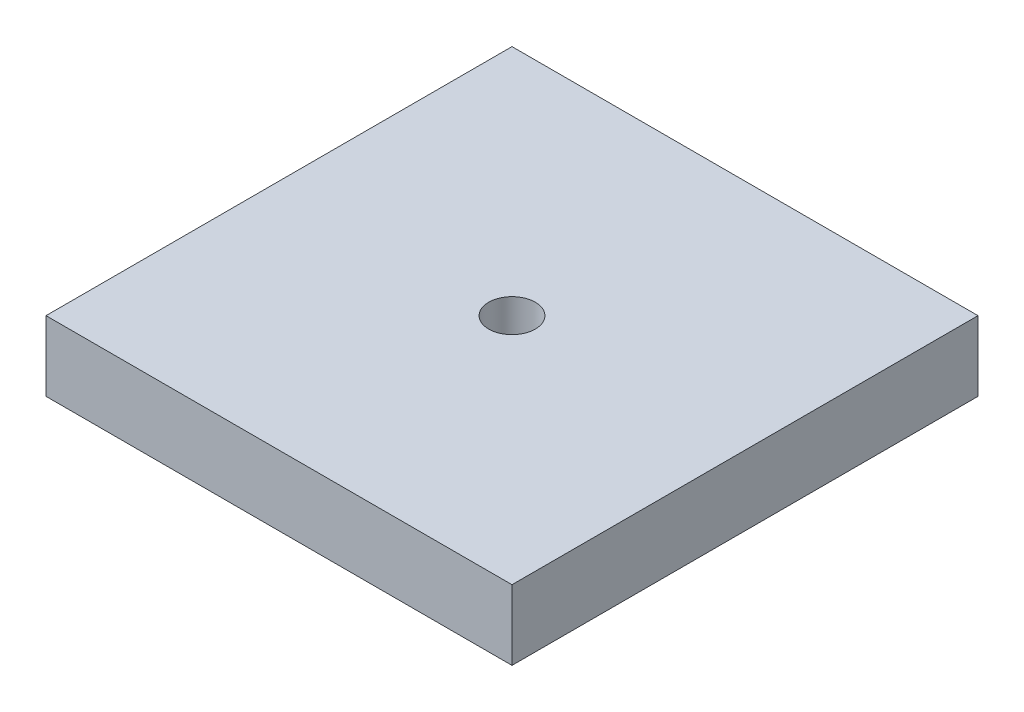
ISO-10303-21;
HEADER;
FILE_DESCRIPTION(('STEP AP214'),'2;1');
FILE_NAME('part.step','',(''),(''),'','','');
FILE_SCHEMA(('AUTOMOTIVE_DESIGN { 1 0 10303 214 1 1 1 1 }'));
ENDSEC;
DATA;
#1=APPLICATION_CONTEXT('core data for automotive mechanical design processes');
#2=APPLICATION_PROTOCOL_DEFINITION('international standard','automotive_design',2000,#1);
#3=PRODUCT_CONTEXT('',#1,'mechanical');
#4=PRODUCT('Part','Part','',(#3));
#5=PRODUCT_RELATED_PRODUCT_CATEGORY('part','',(#4));
#6=PRODUCT_DEFINITION_FORMATION('','',#4);
#7=PRODUCT_DEFINITION_CONTEXT('part definition',#1,'design');
#8=PRODUCT_DEFINITION('design','',#6,#7);
#9=PRODUCT_DEFINITION_SHAPE('','',#8);
#10=(LENGTH_UNIT() NAMED_UNIT(*) SI_UNIT(.MILLI.,.METRE.));
#11=(NAMED_UNIT(*) PLANE_ANGLE_UNIT() SI_UNIT($,.RADIAN.));
#12=(NAMED_UNIT(*) SI_UNIT($,.STERADIAN.) SOLID_ANGLE_UNIT());
#13=UNCERTAINTY_MEASURE_WITH_UNIT(LENGTH_MEASURE(1.E-05),#10,'distance_accuracy_value','');
#14=(GEOMETRIC_REPRESENTATION_CONTEXT(3) GLOBAL_UNCERTAINTY_ASSIGNED_CONTEXT((#13)) GLOBAL_UNIT_ASSIGNED_CONTEXT((#10,
#11,#12)) REPRESENTATION_CONTEXT('',''));
#15=CARTESIAN_POINT('',(0.,0.,0.));
#16=DIRECTION('',(0.,0.,1.));
#17=DIRECTION('',(1.,0.,0.));
#18=AXIS2_PLACEMENT_3D('',#15,#16,#17);
#19=CARTESIAN_POINT('',(0.,38.1,0.));
#20=DIRECTION('',(0.,1.,0.));
#21=DIRECTION('',(0.,0.,1.));
#22=AXIS2_PLACEMENT_3D('',#19,#20,#21);
#23=PLANE('',#22);
#24=DIRECTION('',(0.,0.,-1.));
#25=VECTOR('',#24,1.);
#26=CARTESIAN_POINT('',(127.,38.1,-127.));
#27=LINE('',#26,#25);
#28=CARTESIAN_POINT('',(127.,38.1,127.));
#29=VERTEX_POINT('',#28);
#30=CARTESIAN_POINT('',(127.,38.1,-127.));
#31=VERTEX_POINT('',#30);
#32=EDGE_CURVE('E85',#29,#31,#27,.T.);
#33=ORIENTED_EDGE('',*,*,#32,.T.);
#34=DIRECTION('',(-1.,0.,0.));
#35=VECTOR('',#34,1.);
#36=CARTESIAN_POINT('',(-127.,38.1,-127.));
#37=LINE('',#36,#35);
#38=CARTESIAN_POINT('',(-127.,38.1,-127.));
#39=VERTEX_POINT('',#38);
#40=EDGE_CURVE('E80',#31,#39,#37,.T.);
#41=ORIENTED_EDGE('',*,*,#40,.T.);
#42=DIRECTION('',(0.,0.,1.));
#43=VECTOR('',#42,1.);
#44=CARTESIAN_POINT('',(-127.,38.1,-127.));
#45=LINE('',#44,#43);
#46=CARTESIAN_POINT('',(-127.,38.1,127.));
#47=VERTEX_POINT('',#46);
#48=EDGE_CURVE('E83',#39,#47,#45,.T.);
#49=ORIENTED_EDGE('',*,*,#48,.T.);
#50=DIRECTION('',(1.,0.,0.));
#51=VECTOR('',#50,1.);
#52=CARTESIAN_POINT('',(-127.,38.1,127.));
#53=LINE('',#52,#51);
#54=EDGE_CURVE('E50',#47,#29,#53,.T.);
#55=ORIENTED_EDGE('',*,*,#54,.T.);
#56=EDGE_LOOP('',(#33,#41,#49,#55));
#57=FACE_BOUND('',#56,.T.);
#58=CARTESIAN_POINT('',(0.,38.1,0.));
#59=DIRECTION('',(0.,1.,0.));
#60=DIRECTION('',(0.,0.,1.));
#61=AXIS2_PLACEMENT_3D('',#58,#59,#60);
#62=CIRCLE('',#61,12.7);
#63=CARTESIAN_POINT('',(0.,38.1,-12.7));
#64=VERTEX_POINT('',#63);
#65=EDGE_CURVE('E100',#64,#64,#62,.T.);
#66=ORIENTED_EDGE('',*,*,#65,.F.);
#67=EDGE_LOOP('',(#66));
#68=FACE_BOUND('',#67,.T.);
#69=ADVANCED_FACE('F33',(#57,#68),#23,.T.);
#70=CARTESIAN_POINT('',(0.,0.,0.));
#71=DIRECTION('',(0.,1.,0.));
#72=DIRECTION('',(0.,0.,1.));
#73=AXIS2_PLACEMENT_3D('',#70,#71,#72);
#74=PLANE('',#73);
#75=DIRECTION('',(0.,0.,-1.));
#76=VECTOR('',#75,1.);
#77=CARTESIAN_POINT('',(127.,0.,-127.));
#78=LINE('',#77,#76);
#79=CARTESIAN_POINT('',(127.,0.,127.));
#80=VERTEX_POINT('',#79);
#81=CARTESIAN_POINT('',(127.,0.,-127.));
#82=VERTEX_POINT('',#81);
#83=EDGE_CURVE('E97',#80,#82,#78,.T.);
#84=ORIENTED_EDGE('',*,*,#83,.F.);
#85=DIRECTION('',(1.,0.,0.));
#86=VECTOR('',#85,1.);
#87=CARTESIAN_POINT('',(-127.,0.,127.));
#88=LINE('',#87,#86);
#89=CARTESIAN_POINT('',(-127.,0.,127.));
#90=VERTEX_POINT('',#89);
#91=EDGE_CURVE('E73',#90,#80,#88,.T.);
#92=ORIENTED_EDGE('',*,*,#91,.F.);
#93=DIRECTION('',(0.,0.,1.));
#94=VECTOR('',#93,1.);
#95=CARTESIAN_POINT('',(-127.,0.,-127.));
#96=LINE('',#95,#94);
#97=CARTESIAN_POINT('',(-127.,0.,-127.));
#98=VERTEX_POINT('',#97);
#99=EDGE_CURVE('E67',#98,#90,#96,.T.);
#100=ORIENTED_EDGE('',*,*,#99,.F.);
#101=DIRECTION('',(-1.,0.,0.));
#102=VECTOR('',#101,1.);
#103=CARTESIAN_POINT('',(-127.,0.,-127.));
#104=LINE('',#103,#102);
#105=EDGE_CURVE('E89',#82,#98,#104,.T.);
#106=ORIENTED_EDGE('',*,*,#105,.F.);
#107=EDGE_LOOP('',(#84,#92,#100,#106));
#108=FACE_BOUND('',#107,.T.);
#109=CARTESIAN_POINT('',(0.,0.,0.));
#110=DIRECTION('',(0.,1.,0.));
#111=DIRECTION('',(0.,0.,1.));
#112=AXIS2_PLACEMENT_3D('',#109,#110,#111);
#113=CIRCLE('',#112,12.7);
#114=CARTESIAN_POINT('',(0.,0.,-12.7));
#115=VERTEX_POINT('',#114);
#116=EDGE_CURVE('E112',#115,#115,#113,.T.);
#117=ORIENTED_EDGE('',*,*,#116,.T.);
#118=EDGE_LOOP('',(#117));
#119=FACE_BOUND('',#118,.T.);
#120=ADVANCED_FACE('F108',(#108,#119),#74,.F.);
#121=CARTESIAN_POINT('',(127.,38.1,-127.));
#122=DIRECTION('',(-1.,0.,0.));
#123=DIRECTION('',(0.,0.,1.));
#124=AXIS2_PLACEMENT_3D('',#121,#122,#123);
#125=PLANE('',#124);
#126=ORIENTED_EDGE('',*,*,#83,.T.);
#127=DIRECTION('',(0.,-1.,0.));
#128=VECTOR('',#127,1.);
#129=CARTESIAN_POINT('',(127.,38.1,-127.));
#130=LINE('',#129,#128);
#131=EDGE_CURVE('E11',#31,#82,#130,.T.);
#132=ORIENTED_EDGE('',*,*,#131,.F.);
#133=ORIENTED_EDGE('',*,*,#32,.F.);
#134=DIRECTION('',(0.,-1.,0.));
#135=VECTOR('',#134,1.);
#136=CARTESIAN_POINT('',(127.,38.1,127.));
#137=LINE('',#136,#135);
#138=EDGE_CURVE('E93',#29,#80,#137,.T.);
#139=ORIENTED_EDGE('',*,*,#138,.T.);
#140=EDGE_LOOP('',(#126,#132,#133,#139));
#141=FACE_BOUND('',#140,.T.);
#142=ADVANCED_FACE('F35',(#141),#125,.F.);
#143=CARTESIAN_POINT('',(-127.,38.1,-127.));
#144=DIRECTION('',(0.,0.,1.));
#145=DIRECTION('',(1.,0.,0.));
#146=AXIS2_PLACEMENT_3D('',#143,#144,#145);
#147=PLANE('',#146);
#148=ORIENTED_EDGE('',*,*,#105,.T.);
#149=DIRECTION('',(0.,-1.,0.));
#150=VECTOR('',#149,1.);
#151=CARTESIAN_POINT('',(-127.,38.1,-127.));
#152=LINE('',#151,#150);
#153=EDGE_CURVE('E42',#39,#98,#152,.T.);
#154=ORIENTED_EDGE('',*,*,#153,.F.);
#155=ORIENTED_EDGE('',*,*,#40,.F.);
#156=ORIENTED_EDGE('',*,*,#131,.T.);
#157=EDGE_LOOP('',(#148,#154,#155,#156));
#158=FACE_BOUND('',#157,.T.);
#159=ADVANCED_FACE('F88',(#158),#147,.F.);
#160=CARTESIAN_POINT('',(-127.,38.1,-127.));
#161=DIRECTION('',(1.,0.,0.));
#162=DIRECTION('',(0.,0.,-1.));
#163=AXIS2_PLACEMENT_3D('',#160,#161,#162);
#164=PLANE('',#163);
#165=ORIENTED_EDGE('',*,*,#99,.T.);
#166=DIRECTION('',(0.,-1.,0.));
#167=VECTOR('',#166,1.);
#168=CARTESIAN_POINT('',(-127.,38.1,127.));
#169=LINE('',#168,#167);
#170=EDGE_CURVE('E90',#47,#90,#169,.T.);
#171=ORIENTED_EDGE('',*,*,#170,.F.);
#172=ORIENTED_EDGE('',*,*,#48,.F.);
#173=ORIENTED_EDGE('',*,*,#153,.T.);
#174=EDGE_LOOP('',(#165,#171,#172,#173));
#175=FACE_BOUND('',#174,.T.);
#176=ADVANCED_FACE('F91',(#175),#164,.F.);
#177=CARTESIAN_POINT('',(-127.,38.1,127.));
#178=DIRECTION('',(0.,0.,-1.));
#179=DIRECTION('',(-1.,0.,0.));
#180=AXIS2_PLACEMENT_3D('',#177,#178,#179);
#181=PLANE('',#180);
#182=ORIENTED_EDGE('',*,*,#91,.T.);
#183=ORIENTED_EDGE('',*,*,#138,.F.);
#184=ORIENTED_EDGE('',*,*,#54,.F.);
#185=ORIENTED_EDGE('',*,*,#170,.T.);
#186=EDGE_LOOP('',(#182,#183,#184,#185));
#187=FACE_BOUND('',#186,.T.);
#188=ADVANCED_FACE('F105',(#187),#181,.F.);
#189=CARTESIAN_POINT('',(0.,38.1,0.));
#190=DIRECTION('',(0.,-1.,0.));
#191=DIRECTION('',(0.,0.,-1.));
#192=AXIS2_PLACEMENT_3D('',#189,#190,#191);
#193=CYLINDRICAL_SURFACE('',#192,12.7);
#194=CARTESIAN_POINT('',(0.,38.1,-12.7));
#195=CARTESIAN_POINT('',(0.,37.703125,-12.7));
#196=CARTESIAN_POINT('',(0.,37.30625,-12.7));
#197=CARTESIAN_POINT('',(0.,36.5125,-12.7));
#198=CARTESIAN_POINT('',(0.,36.115625,-12.7));
#199=CARTESIAN_POINT('',(0.,35.321875,-12.7));
#200=CARTESIAN_POINT('',(0.,34.925,-12.7));
#201=CARTESIAN_POINT('',(0.,34.13125,-12.7));
#202=CARTESIAN_POINT('',(0.,33.734375,-12.7));
#203=CARTESIAN_POINT('',(0.,32.940625,-12.7));
#204=CARTESIAN_POINT('',(0.,32.54375,-12.7));
#205=CARTESIAN_POINT('',(0.,31.75,-12.7));
#206=CARTESIAN_POINT('',(0.,31.353125,-12.7));
#207=CARTESIAN_POINT('',(0.,30.559375,-12.7));
#208=CARTESIAN_POINT('',(0.,30.1625,-12.7));
#209=CARTESIAN_POINT('',(0.,29.36875,-12.7));
#210=CARTESIAN_POINT('',(0.,28.971875,-12.7));
#211=CARTESIAN_POINT('',(0.,28.178125,-12.7));
#212=CARTESIAN_POINT('',(0.,27.78125,-12.7));
#213=CARTESIAN_POINT('',(0.,26.9875,-12.7));
#214=CARTESIAN_POINT('',(0.,26.590625,-12.7));
#215=CARTESIAN_POINT('',(0.,25.796875,-12.7));
#216=CARTESIAN_POINT('',(0.,25.4,-12.7));
#217=CARTESIAN_POINT('',(0.,24.60625,-12.7));
#218=CARTESIAN_POINT('',(0.,24.209375,-12.7));
#219=CARTESIAN_POINT('',(0.,23.415625,-12.7));
#220=CARTESIAN_POINT('',(0.,23.01875,-12.7));
#221=CARTESIAN_POINT('',(0.,22.225,-12.7));
#222=CARTESIAN_POINT('',(0.,21.828125,-12.7));
#223=CARTESIAN_POINT('',(0.,21.034375,-12.7));
#224=CARTESIAN_POINT('',(0.,20.6375,-12.7));
#225=CARTESIAN_POINT('',(0.,19.84375,-12.7));
#226=CARTESIAN_POINT('',(0.,19.446875,-12.7));
#227=CARTESIAN_POINT('',(0.,18.653125,-12.7));
#228=CARTESIAN_POINT('',(0.,18.25625,-12.7));
#229=CARTESIAN_POINT('',(0.,17.4625,-12.7));
#230=CARTESIAN_POINT('',(0.,17.065625,-12.7));
#231=CARTESIAN_POINT('',(0.,16.271875,-12.7));
#232=CARTESIAN_POINT('',(0.,15.875,-12.7));
#233=CARTESIAN_POINT('',(0.,15.08125,-12.7));
#234=CARTESIAN_POINT('',(0.,14.684375,-12.7));
#235=CARTESIAN_POINT('',(0.,13.890625,-12.7));
#236=CARTESIAN_POINT('',(0.,13.49375,-12.7));
#237=CARTESIAN_POINT('',(0.,12.7,-12.7));
#238=CARTESIAN_POINT('',(0.,12.303125,-12.7));
#239=CARTESIAN_POINT('',(0.,11.509375,-12.7));
#240=CARTESIAN_POINT('',(0.,11.1125,-12.7));
#241=CARTESIAN_POINT('',(0.,10.31875,-12.7));
#242=CARTESIAN_POINT('',(0.,9.92187499999999,-12.7));
#243=CARTESIAN_POINT('',(0.,9.128125,-12.7));
#244=CARTESIAN_POINT('',(0.,8.73124999999999,-12.7));
#245=CARTESIAN_POINT('',(0.,7.93749999999999,-12.7));
#246=CARTESIAN_POINT('',(0.,7.54062499999999,-12.7));
#247=CARTESIAN_POINT('',(0.,6.746875,-12.7));
#248=CARTESIAN_POINT('',(0.,6.35,-12.7));
#249=CARTESIAN_POINT('',(0.,5.55625,-12.7));
#250=CARTESIAN_POINT('',(0.,5.159375,-12.7));
#251=CARTESIAN_POINT('',(0.,4.365625,-12.7));
#252=CARTESIAN_POINT('',(0.,3.96875,-12.7));
#253=CARTESIAN_POINT('',(0.,3.175,-12.7));
#254=CARTESIAN_POINT('',(0.,2.778125,-12.7));
#255=CARTESIAN_POINT('',(0.,1.984375,-12.7));
#256=CARTESIAN_POINT('',(0.,1.5875,-12.7));
#257=CARTESIAN_POINT('',(0.,0.79375,-12.7));
#258=CARTESIAN_POINT('',(0.,0.396875,-12.7));
#259=CARTESIAN_POINT('',(0.,0.,-12.7));
#260=B_SPLINE_CURVE_WITH_KNOTS('',3,(#194,#195,#196,#197,#198,#199,#200,#201,#202,#203,#204,
#205,#206,#207,#208,#209,#210,#211,#212,#213,#214,#215,#216,#217,#218,#219,#220,#221,#222,#223,
#224,#225,#226,#227,#228,#229,#230,#231,#232,#233,#234,#235,#236,#237,#238,#239,#240,#241,#242,
#243,#244,#245,#246,#247,#248,#249,#250,#251,#252,#253,#254,#255,#256,#257,#258,#259),
.UNSPECIFIED.,.F.,.F.,(4,2,2,2,2,2,2,2,2,2,2,2,2,2,2,2,2,2,2,2,2,2,2,2,2,2,2,2,2,2,2,2,4),(0.,
1.190625,2.38125,3.571875,4.7625,5.953125,7.14375,8.334375,9.52500000000001,10.715625,11.90625,
13.096875,14.2875,15.478125,16.66875,17.859375,19.05,20.240625,21.43125,22.621875,23.8125,
25.003125,26.19375,27.384375,28.575,29.765625,30.95625,32.146875,33.3375,34.528125,35.71875,
36.909375,38.1),.UNSPECIFIED.);
#261=EDGE_CURVE('BSEAM118',#64,#115,#260,.T.);
#262=ORIENTED_EDGE('',*,*,#65,.T.);
#263=ORIENTED_EDGE('',*,*,#116,.F.);
#264=ORIENTED_EDGE('',*,*,#261,.T.);
#265=ORIENTED_EDGE('',*,*,#261,.F.);
#266=EDGE_LOOP('',(#262,#264,#263,#265));
#267=FACE_BOUND('',#266,.T.);
#268=ADVANCED_FACE('F118',(#267),#193,.F.);
#269=CLOSED_SHELL('',(#69,#120,#142,#159,#176,#188,#268));
#270=MANIFOLD_SOLID_BREP('B2',#269);
#271=ADVANCED_BREP_SHAPE_REPRESENTATION('',(#18,#270),#14);
#272=SHAPE_DEFINITION_REPRESENTATION(#9,#271);
ENDSEC;
END-ISO-10303-21;
